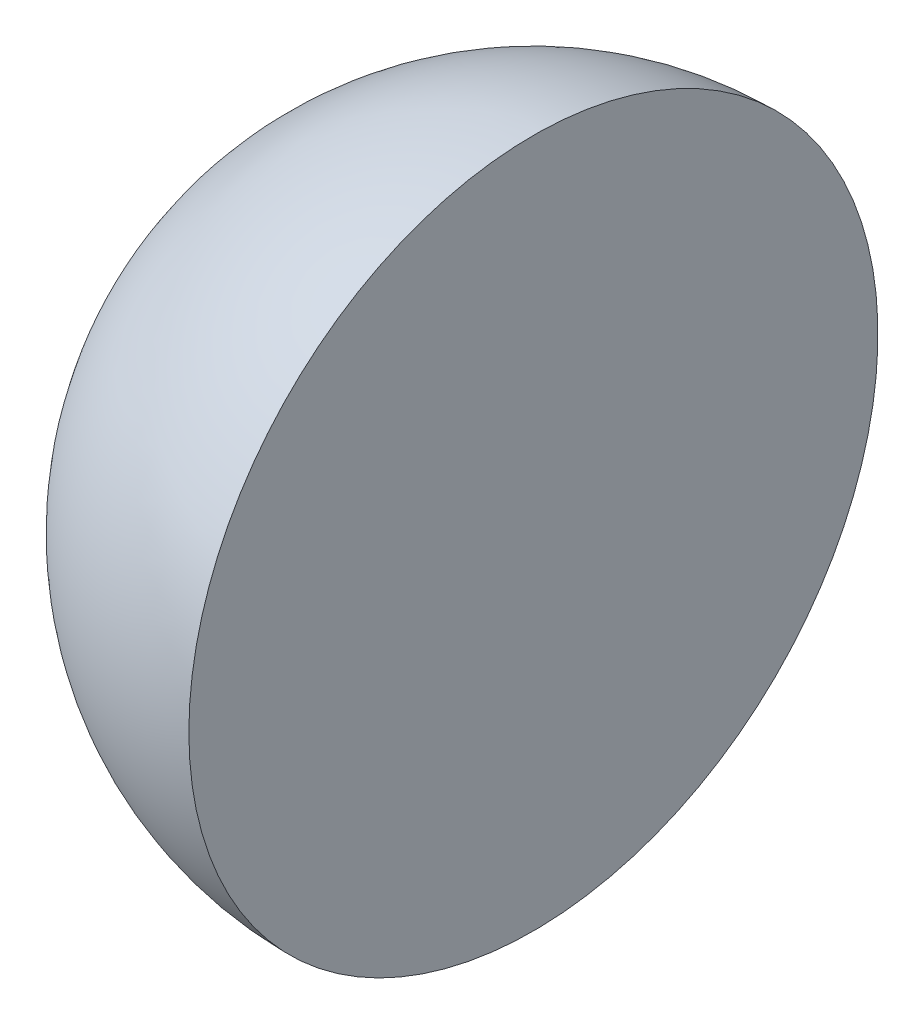
ISO-10303-21;
HEADER;
FILE_DESCRIPTION(('STEP AP214'),'2;1');
FILE_NAME('part.step','',(''),(''),'','','');
FILE_SCHEMA(('AUTOMOTIVE_DESIGN { 1 0 10303 214 1 1 1 1 }'));
ENDSEC;
DATA;
#1=APPLICATION_CONTEXT('core data for automotive mechanical design processes');
#2=APPLICATION_PROTOCOL_DEFINITION('international standard','automotive_design',2000,#1);
#3=PRODUCT_CONTEXT('',#1,'mechanical');
#4=PRODUCT('Part','Part','',(#3));
#5=PRODUCT_RELATED_PRODUCT_CATEGORY('part','',(#4));
#6=PRODUCT_DEFINITION_FORMATION('','',#4);
#7=PRODUCT_DEFINITION_CONTEXT('part definition',#1,'design');
#8=PRODUCT_DEFINITION('design','',#6,#7);
#9=PRODUCT_DEFINITION_SHAPE('','',#8);
#10=(LENGTH_UNIT() NAMED_UNIT(*) SI_UNIT(.MILLI.,.METRE.));
#11=(NAMED_UNIT(*) PLANE_ANGLE_UNIT() SI_UNIT($,.RADIAN.));
#12=(NAMED_UNIT(*) SI_UNIT($,.STERADIAN.) SOLID_ANGLE_UNIT());
#13=UNCERTAINTY_MEASURE_WITH_UNIT(LENGTH_MEASURE(1.E-05),#10,'distance_accuracy_value','');
#14=(GEOMETRIC_REPRESENTATION_CONTEXT(3) GLOBAL_UNCERTAINTY_ASSIGNED_CONTEXT((#13)) GLOBAL_UNIT_ASSIGNED_CONTEXT((#10,
#11,#12)) REPRESENTATION_CONTEXT('',''));
#15=CARTESIAN_POINT('',(0.,0.,0.));
#16=DIRECTION('',(0.,0.,1.));
#17=DIRECTION('',(1.,0.,0.));
#18=AXIS2_PLACEMENT_3D('',#15,#16,#17);
#19=CARTESIAN_POINT('',(0.,0.,0.));
#20=DIRECTION('',(0.,0.,1.));
#21=DIRECTION('',(0.,-1.,0.));
#22=AXIS2_PLACEMENT_3D('',#19,#20,#21);
#23=SPHERICAL_SURFACE('',#22,25.4);
#24=CARTESIAN_POINT('',(0.,0.,0.));
#25=DIRECTION('',(-1.,0.,0.));
#26=DIRECTION('',(0.,0.,1.));
#27=AXIS2_PLACEMENT_3D('',#24,#25,#26);
#28=SPHERICAL_SURFACE('',#27,25.4);
#29=CARTESIAN_POINT('',(0.,0.,0.));
#30=DIRECTION('',(-1.,0.,0.));
#31=DIRECTION('',(0.,0.,1.));
#32=AXIS2_PLACEMENT_3D('',#29,#30,#31);
#33=CIRCLE('',#32,25.4);
#34=CARTESIAN_POINT('',(0.,0.,25.4));
#35=VERTEX_POINT('',#34);
#36=EDGE_CURVE('E10',#35,#35,#33,.T.);
#37=ORIENTED_EDGE('',*,*,#36,.T.);
#38=EDGE_LOOP('',(#37));
#39=FACE_BOUND('',#38,.T.);
#40=ADVANCED_FACE('F33',(#39),#28,.T.);
#41=CARTESIAN_POINT('',(0.,0.,0.));
#42=DIRECTION('',(1.,0.,0.));
#43=DIRECTION('',(0.,0.,1.));
#44=AXIS2_PLACEMENT_3D('',#41,#42,#43);
#45=PLANE('',#44);
#46=ORIENTED_EDGE('',*,*,#36,.F.);
#47=EDGE_LOOP('',(#46));
#48=FACE_BOUND('',#47,.T.);
#49=ADVANCED_FACE('F41',(#48),#45,.T.);
#50=CLOSED_SHELL('',(#40,#49));
#51=MANIFOLD_SOLID_BREP('B2',#50);
#52=ADVANCED_BREP_SHAPE_REPRESENTATION('',(#18,#51),#14);
#53=SHAPE_DEFINITION_REPRESENTATION(#9,#52);
ENDSEC;
END-ISO-10303-21;
